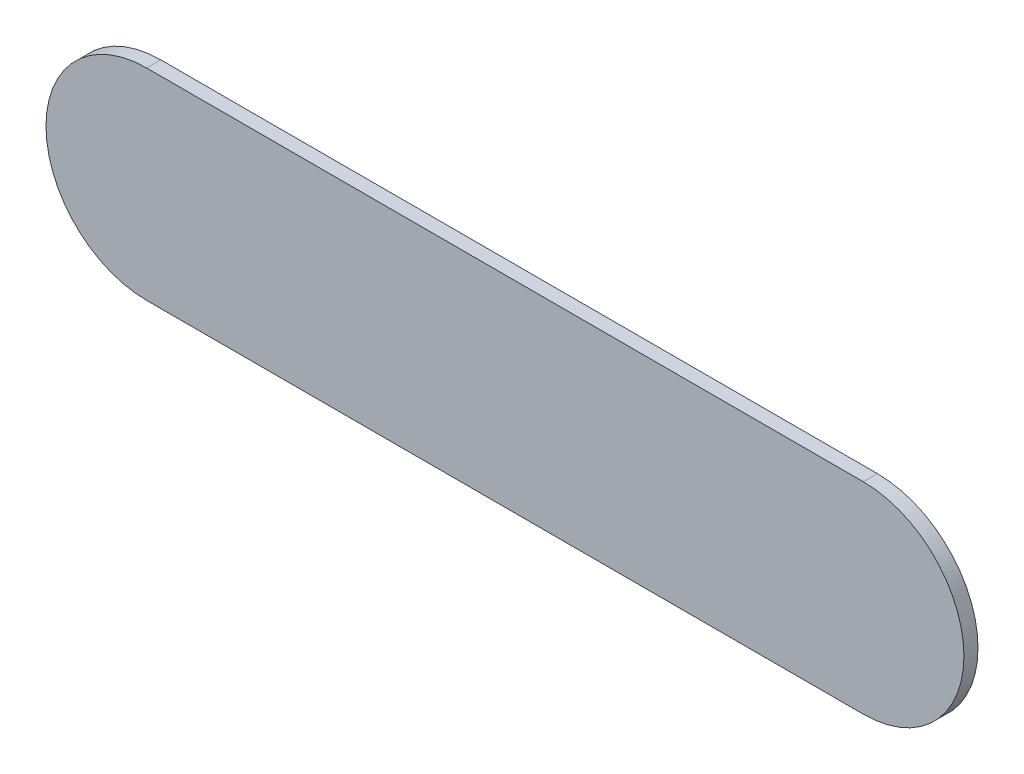
ISO-10303-21;
HEADER;
FILE_DESCRIPTION(('STEP AP214'),'2;1');
FILE_NAME('part.step','',(''),(''),'','','');
FILE_SCHEMA(('AUTOMOTIVE_DESIGN { 1 0 10303 214 1 1 1 1 }'));
ENDSEC;
DATA;
#1=APPLICATION_CONTEXT('core data for automotive mechanical design processes');
#2=APPLICATION_PROTOCOL_DEFINITION('international standard','automotive_design',2000,#1);
#3=PRODUCT_CONTEXT('',#1,'mechanical');
#4=PRODUCT('Part','Part','',(#3));
#5=PRODUCT_RELATED_PRODUCT_CATEGORY('part','',(#4));
#6=PRODUCT_DEFINITION_FORMATION('','',#4);
#7=PRODUCT_DEFINITION_CONTEXT('part definition',#1,'design');
#8=PRODUCT_DEFINITION('design','',#6,#7);
#9=PRODUCT_DEFINITION_SHAPE('','',#8);
#10=(LENGTH_UNIT() NAMED_UNIT(*) SI_UNIT(.MILLI.,.METRE.));
#11=(NAMED_UNIT(*) PLANE_ANGLE_UNIT() SI_UNIT($,.RADIAN.));
#12=(NAMED_UNIT(*) SI_UNIT($,.STERADIAN.) SOLID_ANGLE_UNIT());
#13=UNCERTAINTY_MEASURE_WITH_UNIT(LENGTH_MEASURE(1.E-05),#10,'distance_accuracy_value','');
#14=(GEOMETRIC_REPRESENTATION_CONTEXT(3) GLOBAL_UNCERTAINTY_ASSIGNED_CONTEXT((#13)) GLOBAL_UNIT_ASSIGNED_CONTEXT((#10,
#11,#12)) REPRESENTATION_CONTEXT('',''));
#15=CARTESIAN_POINT('',(0.,0.,0.));
#16=DIRECTION('',(0.,0.,1.));
#17=DIRECTION('',(1.,0.,0.));
#18=AXIS2_PLACEMENT_3D('',#15,#16,#17);
#19=CARTESIAN_POINT('',(152.38,-108.87,1.635));
#20=DIRECTION('',(0.,0.,1.));
#21=DIRECTION('',(1.,0.,0.));
#22=AXIS2_PLACEMENT_3D('',#19,#20,#21);
#23=PLANE('',#22);
#24=DIRECTION('',(-1.,0.,0.));
#25=VECTOR('',#24,1.);
#26=CARTESIAN_POINT('',(152.38,-108.87,1.635));
#27=LINE('',#26,#25);
#28=CARTESIAN_POINT('',(152.38,-108.87,1.635));
#29=VERTEX_POINT('',#28);
#30=CARTESIAN_POINT('',(150.6,-108.87,1.635));
#31=VERTEX_POINT('',#30);
#32=EDGE_CURVE('E79',#29,#31,#27,.T.);
#33=ORIENTED_EDGE('',*,*,#32,.T.);
#34=CARTESIAN_POINT('',(150.6,-109.12,1.635));
#35=DIRECTION('',(0.,0.,1.));
#36=DIRECTION('',(0.,1.,0.));
#37=AXIS2_PLACEMENT_3D('',#34,#35,#36);
#38=CIRCLE('',#37,0.25);
#39=CARTESIAN_POINT('',(150.6,-109.37,1.635));
#40=VERTEX_POINT('',#39);
#41=EDGE_CURVE('E98',#31,#40,#38,.T.);
#42=ORIENTED_EDGE('',*,*,#41,.T.);
#43=DIRECTION('',(1.,0.,0.));
#44=VECTOR('',#43,1.);
#45=CARTESIAN_POINT('',(150.6,-109.37,1.635));
#46=LINE('',#45,#44);
#47=CARTESIAN_POINT('',(152.38,-109.37,1.635));
#48=VERTEX_POINT('',#47);
#49=EDGE_CURVE('E72',#40,#48,#46,.T.);
#50=ORIENTED_EDGE('',*,*,#49,.T.);
#51=CARTESIAN_POINT('',(152.38,-109.12,1.635));
#52=DIRECTION('',(0.,0.,1.));
#53=DIRECTION('',(0.,-1.,0.));
#54=AXIS2_PLACEMENT_3D('',#51,#52,#53);
#55=CIRCLE('',#54,0.25);
#56=EDGE_CURVE('E11',#48,#29,#55,.T.);
#57=ORIENTED_EDGE('',*,*,#56,.T.);
#58=EDGE_LOOP('',(#33,#42,#50,#57));
#59=FACE_BOUND('',#58,.T.);
#60=ADVANCED_FACE('F17',(#59),#23,.T.);
#61=CARTESIAN_POINT('',(152.38,-108.87,1.6));
#62=DIRECTION('',(0.,0.,1.));
#63=DIRECTION('',(1.,0.,0.));
#64=AXIS2_PLACEMENT_3D('',#61,#62,#63);
#65=PLANE('',#64);
#66=CARTESIAN_POINT('',(152.38,-109.12,1.6));
#67=DIRECTION('',(0.,0.,1.));
#68=DIRECTION('',(0.,-1.,0.));
#69=AXIS2_PLACEMENT_3D('',#66,#67,#68);
#70=CIRCLE('',#69,0.25);
#71=CARTESIAN_POINT('',(152.38,-109.37,1.6));
#72=VERTEX_POINT('',#71);
#73=CARTESIAN_POINT('',(152.38,-108.87,1.6));
#74=VERTEX_POINT('',#73);
#75=EDGE_CURVE('E26',#72,#74,#70,.T.);
#76=ORIENTED_EDGE('',*,*,#75,.F.);
#77=DIRECTION('',(1.,0.,0.));
#78=VECTOR('',#77,1.);
#79=CARTESIAN_POINT('',(150.6,-109.37,1.6));
#80=LINE('',#79,#78);
#81=CARTESIAN_POINT('',(150.6,-109.37,1.6));
#82=VERTEX_POINT('',#81);
#83=EDGE_CURVE('E97',#82,#72,#80,.T.);
#84=ORIENTED_EDGE('',*,*,#83,.F.);
#85=CARTESIAN_POINT('',(150.6,-109.12,1.6));
#86=DIRECTION('',(0.,0.,1.));
#87=DIRECTION('',(0.,1.,0.));
#88=AXIS2_PLACEMENT_3D('',#85,#86,#87);
#89=CIRCLE('',#88,0.25);
#90=CARTESIAN_POINT('',(150.6,-108.87,1.6));
#91=VERTEX_POINT('',#90);
#92=EDGE_CURVE('E81',#91,#82,#89,.T.);
#93=ORIENTED_EDGE('',*,*,#92,.F.);
#94=DIRECTION('',(-1.,0.,0.));
#95=VECTOR('',#94,1.);
#96=CARTESIAN_POINT('',(152.38,-108.87,1.6));
#97=LINE('',#96,#95);
#98=EDGE_CURVE('E77',#74,#91,#97,.T.);
#99=ORIENTED_EDGE('',*,*,#98,.F.);
#100=EDGE_LOOP('',(#76,#84,#93,#99));
#101=FACE_BOUND('',#100,.T.);
#102=ADVANCED_FACE('F83',(#101),#65,.F.);
#103=CARTESIAN_POINT('',(152.38,-109.12,1.6));
#104=DIRECTION('',(0.,0.,-1.));
#105=DIRECTION('',(0.,-1.,0.));
#106=AXIS2_PLACEMENT_3D('',#103,#104,#105);
#107=CYLINDRICAL_SURFACE('',#106,0.25);
#108=ORIENTED_EDGE('',*,*,#75,.T.);
#109=DIRECTION('',(0.,0.,1.));
#110=VECTOR('',#109,1.);
#111=CARTESIAN_POINT('',(152.38,-108.87,1.6));
#112=LINE('',#111,#110);
#113=EDGE_CURVE('E64',#74,#29,#112,.T.);
#114=ORIENTED_EDGE('',*,*,#113,.T.);
#115=ORIENTED_EDGE('',*,*,#56,.F.);
#116=DIRECTION('',(0.,0.,1.));
#117=VECTOR('',#116,1.);
#118=CARTESIAN_POINT('',(152.38,-109.37,1.6));
#119=LINE('',#118,#117);
#120=EDGE_CURVE('E67',#72,#48,#119,.T.);
#121=ORIENTED_EDGE('',*,*,#120,.F.);
#122=EDGE_LOOP('',(#108,#114,#115,#121));
#123=FACE_BOUND('',#122,.T.);
#124=ADVANCED_FACE('F63',(#123),#107,.T.);
#125=CARTESIAN_POINT('',(150.6,-109.37,1.6));
#126=DIRECTION('',(0.,1.,0.));
#127=DIRECTION('',(1.,0.,0.));
#128=AXIS2_PLACEMENT_3D('',#125,#126,#127);
#129=PLANE('',#128);
#130=ORIENTED_EDGE('',*,*,#83,.T.);
#131=ORIENTED_EDGE('',*,*,#120,.T.);
#132=ORIENTED_EDGE('',*,*,#49,.F.);
#133=DIRECTION('',(0.,0.,1.));
#134=VECTOR('',#133,1.);
#135=CARTESIAN_POINT('',(150.6,-109.37,1.6));
#136=LINE('',#135,#134);
#137=EDGE_CURVE('E102',#82,#40,#136,.T.);
#138=ORIENTED_EDGE('',*,*,#137,.F.);
#139=EDGE_LOOP('',(#130,#131,#132,#138));
#140=FACE_BOUND('',#139,.T.);
#141=ADVANCED_FACE('F118',(#140),#129,.F.);
#142=CARTESIAN_POINT('',(150.6,-109.12,1.6));
#143=DIRECTION('',(0.,0.,-1.));
#144=DIRECTION('',(0.,1.,0.));
#145=AXIS2_PLACEMENT_3D('',#142,#143,#144);
#146=CYLINDRICAL_SURFACE('',#145,0.25);
#147=ORIENTED_EDGE('',*,*,#92,.T.);
#148=ORIENTED_EDGE('',*,*,#137,.T.);
#149=ORIENTED_EDGE('',*,*,#41,.F.);
#150=DIRECTION('',(0.,0.,1.));
#151=VECTOR('',#150,1.);
#152=CARTESIAN_POINT('',(150.6,-108.87,1.6));
#153=LINE('',#152,#151);
#154=EDGE_CURVE('E87',#91,#31,#153,.T.);
#155=ORIENTED_EDGE('',*,*,#154,.F.);
#156=EDGE_LOOP('',(#147,#148,#149,#155));
#157=FACE_BOUND('',#156,.T.);
#158=ADVANCED_FACE('F120',(#157),#146,.T.);
#159=CARTESIAN_POINT('',(152.38,-108.87,1.6));
#160=DIRECTION('',(0.,-1.,0.));
#161=DIRECTION('',(0.,0.,-1.));
#162=AXIS2_PLACEMENT_3D('',#159,#160,#161);
#163=PLANE('',#162);
#164=ORIENTED_EDGE('',*,*,#98,.T.);
#165=ORIENTED_EDGE('',*,*,#154,.T.);
#166=ORIENTED_EDGE('',*,*,#32,.F.);
#167=ORIENTED_EDGE('',*,*,#113,.F.);
#168=EDGE_LOOP('',(#164,#165,#166,#167));
#169=FACE_BOUND('',#168,.T.);
#170=ADVANCED_FACE('F75',(#169),#163,.F.);
#171=CLOSED_SHELL('',(#60,#102,#124,#141,#158,#170));
#172=MANIFOLD_SOLID_BREP('B1',#171);
#173=ADVANCED_BREP_SHAPE_REPRESENTATION('',(#18,#172),#14);
#174=SHAPE_DEFINITION_REPRESENTATION(#9,#173);
ENDSEC;
END-ISO-10303-21;
